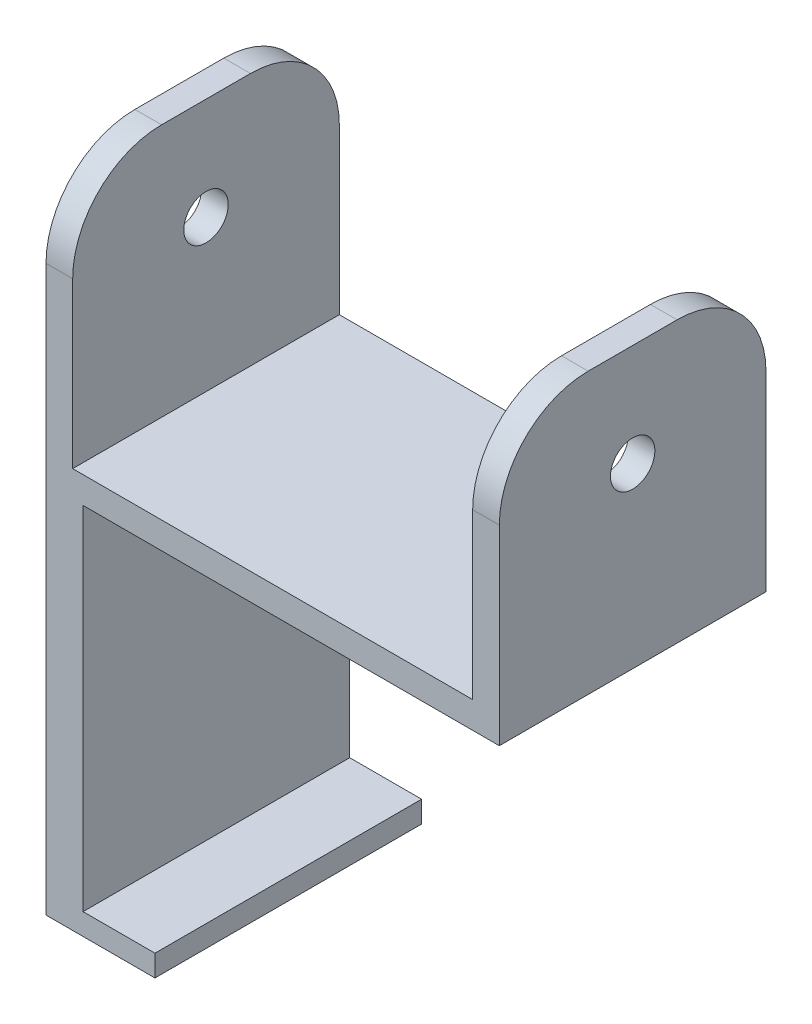
ISO-10303-21;
HEADER;
FILE_DESCRIPTION(('STEP AP214'),'2;1');
FILE_NAME('part.step','',(''),(''),'','','');
FILE_SCHEMA(('AUTOMOTIVE_DESIGN { 1 0 10303 214 1 1 1 1 }'));
ENDSEC;
DATA;
#1=APPLICATION_CONTEXT('core data for automotive mechanical design processes');
#2=APPLICATION_PROTOCOL_DEFINITION('international standard','automotive_design',2000,#1);
#3=PRODUCT_CONTEXT('',#1,'mechanical');
#4=PRODUCT('Part','Part','',(#3));
#5=PRODUCT_RELATED_PRODUCT_CATEGORY('part','',(#4));
#6=PRODUCT_DEFINITION_FORMATION('','',#4);
#7=PRODUCT_DEFINITION_CONTEXT('part definition',#1,'design');
#8=PRODUCT_DEFINITION('design','',#6,#7);
#9=PRODUCT_DEFINITION_SHAPE('','',#8);
#10=(LENGTH_UNIT() NAMED_UNIT(*) SI_UNIT(.MILLI.,.METRE.));
#11=(NAMED_UNIT(*) PLANE_ANGLE_UNIT() SI_UNIT($,.RADIAN.));
#12=(NAMED_UNIT(*) SI_UNIT($,.STERADIAN.) SOLID_ANGLE_UNIT());
#13=UNCERTAINTY_MEASURE_WITH_UNIT(LENGTH_MEASURE(1.E-05),#10,'distance_accuracy_value','');
#14=(GEOMETRIC_REPRESENTATION_CONTEXT(3) GLOBAL_UNCERTAINTY_ASSIGNED_CONTEXT((#13)) GLOBAL_UNIT_ASSIGNED_CONTEXT((#10,
#11,#12)) REPRESENTATION_CONTEXT('',''));
#15=CARTESIAN_POINT('',(0.,0.,0.));
#16=DIRECTION('',(0.,0.,1.));
#17=DIRECTION('',(1.,0.,0.));
#18=AXIS2_PLACEMENT_3D('',#15,#16,#17);
#19=CARTESIAN_POINT('',(27.6785714285714,0.,15.));
#20=DIRECTION('',(-1.,0.,0.));
#21=DIRECTION('',(0.,0.,1.));
#22=AXIS2_PLACEMENT_3D('',#19,#20,#21);
#23=PLANE('',#22);
#24=CARTESIAN_POINT('',(27.6785714285714,18.5,0.));
#25=DIRECTION('',(1.,0.,0.));
#26=DIRECTION('',(0.,0.,-1.));
#27=AXIS2_PLACEMENT_3D('',#24,#25,#26);
#28=CIRCLE('',#27,2.5);
#29=CARTESIAN_POINT('',(27.6785714285714,18.5,-2.5));
#30=VERTEX_POINT('',#29);
#31=EDGE_CURVE('E249',#30,#30,#28,.T.);
#32=ORIENTED_EDGE('',*,*,#31,.F.);
#33=EDGE_LOOP('',(#32));
#34=FACE_BOUND('',#33,.T.);
#35=DIRECTION('',(0.,0.,-1.));
#36=VECTOR('',#35,1.);
#37=CARTESIAN_POINT('',(27.6785714285714,30.,15.));
#38=LINE('',#37,#36);
#39=CARTESIAN_POINT('',(27.6785714285714,30.,5.));
#40=VERTEX_POINT('',#39);
#41=CARTESIAN_POINT('',(27.6785714285714,30.,-5.));
#42=VERTEX_POINT('',#41);
#43=EDGE_CURVE('E212',#40,#42,#38,.T.);
#44=ORIENTED_EDGE('',*,*,#43,.F.);
#45=CARTESIAN_POINT('',(27.6785714285714,20.,5.));
#46=DIRECTION('',(-1.,0.,0.));
#47=DIRECTION('',(0.,0.,1.));
#48=AXIS2_PLACEMENT_3D('',#45,#46,#47);
#49=CIRCLE('',#48,10.);
#50=CARTESIAN_POINT('',(27.6785714285714,20.,15.));
#51=VERTEX_POINT('',#50);
#52=EDGE_CURVE('E222',#40,#51,#49,.F.);
#53=ORIENTED_EDGE('',*,*,#52,.T.);
#54=DIRECTION('',(0.,1.,0.));
#55=VECTOR('',#54,1.);
#56=CARTESIAN_POINT('',(27.6785714285714,0.,15.));
#57=LINE('',#56,#55);
#58=CARTESIAN_POINT('',(27.6785714285714,-1.5,15.));
#59=VERTEX_POINT('',#58);
#60=EDGE_CURVE('E268',#59,#51,#57,.T.);
#61=ORIENTED_EDGE('',*,*,#60,.F.);
#62=DIRECTION('',(0.,0.,-1.));
#63=VECTOR('',#62,1.);
#64=CARTESIAN_POINT('',(27.6785714285714,-1.5,15.));
#65=LINE('',#64,#63);
#66=CARTESIAN_POINT('',(27.6785714285714,-1.5,-15.));
#67=VERTEX_POINT('',#66);
#68=EDGE_CURVE('E168',#59,#67,#65,.T.);
#69=ORIENTED_EDGE('',*,*,#68,.T.);
#70=DIRECTION('',(0.,1.,0.));
#71=VECTOR('',#70,1.);
#72=CARTESIAN_POINT('',(27.6785714285714,0.,-15.));
#73=LINE('',#72,#71);
#74=CARTESIAN_POINT('',(27.6785714285714,20.,-15.));
#75=VERTEX_POINT('',#74);
#76=EDGE_CURVE('E186',#67,#75,#73,.T.);
#77=ORIENTED_EDGE('',*,*,#76,.T.);
#78=CARTESIAN_POINT('',(27.6785714285714,20.,-5.));
#79=DIRECTION('',(-1.,0.,0.));
#80=DIRECTION('',(0.,0.,1.));
#81=AXIS2_PLACEMENT_3D('',#78,#79,#80);
#82=CIRCLE('',#81,10.);
#83=EDGE_CURVE('E220',#75,#42,#82,.F.);
#84=ORIENTED_EDGE('',*,*,#83,.T.);
#85=EDGE_LOOP('',(#44,#53,#61,#69,#77,#84));
#86=FACE_BOUND('',#85,.T.);
#87=ADVANCED_FACE('F32',(#34,#86),#23,.F.);
#88=CARTESIAN_POINT('',(24.6785714285714,30.,15.));
#89=DIRECTION('',(0.,1.,0.));
#90=DIRECTION('',(0.,0.,1.));
#91=AXIS2_PLACEMENT_3D('',#88,#89,#90);
#92=PLANE('',#91);
#93=DIRECTION('',(0.,0.,-1.));
#94=VECTOR('',#93,1.);
#95=CARTESIAN_POINT('',(24.6785714285714,30.,15.));
#96=LINE('',#95,#94);
#97=CARTESIAN_POINT('',(24.6785714285714,30.,5.));
#98=VERTEX_POINT('',#97);
#99=CARTESIAN_POINT('',(24.6785714285714,30.,-5.));
#100=VERTEX_POINT('',#99);
#101=EDGE_CURVE('E209',#98,#100,#96,.T.);
#102=ORIENTED_EDGE('',*,*,#101,.F.);
#103=DIRECTION('',(1.,0.,0.));
#104=VECTOR('',#103,1.);
#105=CARTESIAN_POINT('',(27.6785714285714,30.,5.));
#106=LINE('',#105,#104);
#107=EDGE_CURVE('E217',#98,#40,#106,.T.);
#108=ORIENTED_EDGE('',*,*,#107,.T.);
#109=ORIENTED_EDGE('',*,*,#43,.T.);
#110=DIRECTION('',(1.,0.,0.));
#111=VECTOR('',#110,1.);
#112=CARTESIAN_POINT('',(24.6785714285714,30.,-5.));
#113=LINE('',#112,#111);
#114=EDGE_CURVE('E215',#42,#100,#113,.F.);
#115=ORIENTED_EDGE('',*,*,#114,.T.);
#116=EDGE_LOOP('',(#102,#108,#109,#115));
#117=FACE_BOUND('',#116,.T.);
#118=ADVANCED_FACE('F298',(#117),#92,.T.);
#119=CARTESIAN_POINT('',(24.6785714285714,0.,15.));
#120=DIRECTION('',(-1.,0.,0.));
#121=DIRECTION('',(0.,0.,1.));
#122=AXIS2_PLACEMENT_3D('',#119,#120,#121);
#123=PLANE('',#122);
#124=CARTESIAN_POINT('',(24.6785714285714,18.5,0.));
#125=DIRECTION('',(-1.,0.,0.));
#126=DIRECTION('',(0.,0.,1.));
#127=AXIS2_PLACEMENT_3D('',#124,#125,#126);
#128=CIRCLE('',#127,2.5);
#129=CARTESIAN_POINT('',(24.6785714285714,18.5,2.5));
#130=VERTEX_POINT('',#129);
#131=EDGE_CURVE('E190',#130,#130,#128,.T.);
#132=ORIENTED_EDGE('',*,*,#131,.F.);
#133=EDGE_LOOP('',(#132));
#134=FACE_BOUND('',#133,.T.);
#135=DIRECTION('',(0.,1.,0.));
#136=VECTOR('',#135,1.);
#137=CARTESIAN_POINT('',(24.6785714285714,0.,15.));
#138=LINE('',#137,#136);
#139=CARTESIAN_POINT('',(24.6785714285714,1.5,15.));
#140=VERTEX_POINT('',#139);
#141=CARTESIAN_POINT('',(24.6785714285714,20.,15.));
#142=VERTEX_POINT('',#141);
#143=EDGE_CURVE('E270',#140,#142,#138,.T.);
#144=ORIENTED_EDGE('',*,*,#143,.T.);
#145=CARTESIAN_POINT('',(24.6785714285714,20.,5.));
#146=DIRECTION('',(-1.,0.,0.));
#147=DIRECTION('',(0.,0.,1.));
#148=AXIS2_PLACEMENT_3D('',#145,#146,#147);
#149=CIRCLE('',#148,10.);
#150=EDGE_CURVE('E230',#142,#98,#149,.T.);
#151=ORIENTED_EDGE('',*,*,#150,.T.);
#152=ORIENTED_EDGE('',*,*,#101,.T.);
#153=CARTESIAN_POINT('',(24.6785714285714,20.,-5.));
#154=DIRECTION('',(-1.,0.,0.));
#155=DIRECTION('',(0.,0.,1.));
#156=AXIS2_PLACEMENT_3D('',#153,#154,#155);
#157=CIRCLE('',#156,10.);
#158=CARTESIAN_POINT('',(24.6785714285714,20.,-15.));
#159=VERTEX_POINT('',#158);
#160=EDGE_CURVE('E228',#100,#159,#157,.T.);
#161=ORIENTED_EDGE('',*,*,#160,.T.);
#162=DIRECTION('',(0.,1.,0.));
#163=VECTOR('',#162,1.);
#164=CARTESIAN_POINT('',(24.6785714285714,0.,-15.));
#165=LINE('',#164,#163);
#166=CARTESIAN_POINT('',(24.6785714285714,1.5,-15.));
#167=VERTEX_POINT('',#166);
#168=EDGE_CURVE('E189',#167,#159,#165,.T.);
#169=ORIENTED_EDGE('',*,*,#168,.F.);
#170=DIRECTION('',(0.,0.,-1.));
#171=VECTOR('',#170,1.);
#172=CARTESIAN_POINT('',(24.6785714285714,1.5,15.));
#173=LINE('',#172,#171);
#174=EDGE_CURVE('E207',#140,#167,#173,.T.);
#175=ORIENTED_EDGE('',*,*,#174,.F.);
#176=EDGE_LOOP('',(#144,#151,#152,#161,#169,#175));
#177=FACE_BOUND('',#176,.T.);
#178=ADVANCED_FACE('F290',(#134,#177),#123,.T.);
#179=CARTESIAN_POINT('',(-21.8214285714286,1.5,15.));
#180=DIRECTION('',(0.,1.,0.));
#181=DIRECTION('',(0.,0.,1.));
#182=AXIS2_PLACEMENT_3D('',#179,#180,#181);
#183=PLANE('',#182);
#184=DIRECTION('',(1.,0.,0.));
#185=VECTOR('',#184,1.);
#186=CARTESIAN_POINT('',(-21.8214285714286,1.5,-15.));
#187=LINE('',#186,#185);
#188=CARTESIAN_POINT('',(-20.3214285714286,1.5,-15.));
#189=VERTEX_POINT('',#188);
#190=EDGE_CURVE('E193',#189,#167,#187,.T.);
#191=ORIENTED_EDGE('',*,*,#190,.F.);
#192=DIRECTION('',(0.,0.,-1.));
#193=VECTOR('',#192,1.);
#194=CARTESIAN_POINT('',(-20.3214285714286,1.5,15.));
#195=LINE('',#194,#193);
#196=CARTESIAN_POINT('',(-20.3214285714286,1.5,15.));
#197=VERTEX_POINT('',#196);
#198=EDGE_CURVE('E204',#197,#189,#195,.T.);
#199=ORIENTED_EDGE('',*,*,#198,.F.);
#200=DIRECTION('',(1.,0.,0.));
#201=VECTOR('',#200,1.);
#202=CARTESIAN_POINT('',(-21.8214285714286,1.5,15.));
#203=LINE('',#202,#201);
#204=EDGE_CURVE('E273',#197,#140,#203,.T.);
#205=ORIENTED_EDGE('',*,*,#204,.T.);
#206=ORIENTED_EDGE('',*,*,#174,.T.);
#207=EDGE_LOOP('',(#191,#199,#205,#206));
#208=FACE_BOUND('',#207,.T.);
#209=ADVANCED_FACE('F285',(#208),#183,.T.);
#210=CARTESIAN_POINT('',(-20.3214285714286,30.,15.));
#211=DIRECTION('',(1.,0.,0.));
#212=DIRECTION('',(0.,0.,-1.));
#213=AXIS2_PLACEMENT_3D('',#210,#211,#212);
#214=PLANE('',#213);
#215=CARTESIAN_POINT('',(-20.3214285714286,18.5,0.));
#216=DIRECTION('',(1.,0.,0.));
#217=DIRECTION('',(0.,0.,-1.));
#218=AXIS2_PLACEMENT_3D('',#215,#216,#217);
#219=CIRCLE('',#218,2.5);
#220=CARTESIAN_POINT('',(-20.3214285714286,18.5,-2.5));
#221=VERTEX_POINT('',#220);
#222=EDGE_CURVE('E248',#221,#221,#219,.T.);
#223=ORIENTED_EDGE('',*,*,#222,.F.);
#224=EDGE_LOOP('',(#223));
#225=FACE_BOUND('',#224,.T.);
#226=DIRECTION('',(0.,1.,0.));
#227=VECTOR('',#226,1.);
#228=CARTESIAN_POINT('',(-20.3214285714286,30.,-15.));
#229=LINE('',#228,#227);
#230=CARTESIAN_POINT('',(-20.3214285714286,20.,-15.));
#231=VERTEX_POINT('',#230);
#232=EDGE_CURVE('E196',#231,#189,#229,.F.);
#233=ORIENTED_EDGE('',*,*,#232,.F.);
#234=CARTESIAN_POINT('',(-20.3214285714286,20.,-5.));
#235=DIRECTION('',(1.,0.,0.));
#236=DIRECTION('',(0.,0.,-1.));
#237=AXIS2_PLACEMENT_3D('',#234,#235,#236);
#238=CIRCLE('',#237,10.);
#239=CARTESIAN_POINT('',(-20.3214285714286,30.,-5.));
#240=VERTEX_POINT('',#239);
#241=EDGE_CURVE('E240',#231,#240,#238,.T.);
#242=ORIENTED_EDGE('',*,*,#241,.T.);
#243=DIRECTION('',(0.,0.,-1.));
#244=VECTOR('',#243,1.);
#245=CARTESIAN_POINT('',(-20.3214285714286,30.,15.));
#246=LINE('',#245,#244);
#247=CARTESIAN_POINT('',(-20.3214285714286,30.,5.));
#248=VERTEX_POINT('',#247);
#249=EDGE_CURVE('E202',#248,#240,#246,.T.);
#250=ORIENTED_EDGE('',*,*,#249,.F.);
#251=CARTESIAN_POINT('',(-20.3214285714286,20.,5.));
#252=DIRECTION('',(1.,0.,0.));
#253=DIRECTION('',(0.,0.,-1.));
#254=AXIS2_PLACEMENT_3D('',#251,#252,#253);
#255=CIRCLE('',#254,10.);
#256=CARTESIAN_POINT('',(-20.3214285714286,20.,15.));
#257=VERTEX_POINT('',#256);
#258=EDGE_CURVE('E238',#248,#257,#255,.T.);
#259=ORIENTED_EDGE('',*,*,#258,.T.);
#260=DIRECTION('',(0.,1.,0.));
#261=VECTOR('',#260,1.);
#262=CARTESIAN_POINT('',(-20.3214285714286,30.,15.));
#263=LINE('',#262,#261);
#264=EDGE_CURVE('E174',#257,#197,#263,.F.);
#265=ORIENTED_EDGE('',*,*,#264,.T.);
#266=ORIENTED_EDGE('',*,*,#198,.T.);
#267=EDGE_LOOP('',(#233,#242,#250,#259,#265,#266));
#268=FACE_BOUND('',#267,.T.);
#269=ADVANCED_FACE('F279',(#225,#268),#214,.T.);
#270=CARTESIAN_POINT('',(-23.3214285714286,30.,15.));
#271=DIRECTION('',(0.,1.,0.));
#272=DIRECTION('',(0.,0.,1.));
#273=AXIS2_PLACEMENT_3D('',#270,#271,#272);
#274=PLANE('',#273);
#275=ORIENTED_EDGE('',*,*,#249,.T.);
#276=DIRECTION('',(1.,0.,0.));
#277=VECTOR('',#276,1.);
#278=CARTESIAN_POINT('',(-23.3214285714286,30.,-5.));
#279=LINE('',#278,#277);
#280=CARTESIAN_POINT('',(-23.3214285714286,30.,-5.));
#281=VERTEX_POINT('',#280);
#282=EDGE_CURVE('E57',#240,#281,#279,.F.);
#283=ORIENTED_EDGE('',*,*,#282,.T.);
#284=DIRECTION('',(0.,0.,-1.));
#285=VECTOR('',#284,1.);
#286=CARTESIAN_POINT('',(-23.3214285714286,30.,15.));
#287=LINE('',#286,#285);
#288=CARTESIAN_POINT('',(-23.3214285714286,30.,5.));
#289=VERTEX_POINT('',#288);
#290=EDGE_CURVE('E172',#289,#281,#287,.T.);
#291=ORIENTED_EDGE('',*,*,#290,.F.);
#292=DIRECTION('',(1.,0.,0.));
#293=VECTOR('',#292,1.);
#294=CARTESIAN_POINT('',(-20.3214285714286,30.,5.));
#295=LINE('',#294,#293);
#296=EDGE_CURVE('E242',#289,#248,#295,.T.);
#297=ORIENTED_EDGE('',*,*,#296,.T.);
#298=EDGE_LOOP('',(#275,#283,#291,#297));
#299=FACE_BOUND('',#298,.T.);
#300=ADVANCED_FACE('F311',(#299),#274,.T.);
#301=CARTESIAN_POINT('',(-23.3214285714286,30.,15.));
#302=DIRECTION('',(1.,0.,0.));
#303=DIRECTION('',(0.,0.,-1.));
#304=AXIS2_PLACEMENT_3D('',#301,#302,#303);
#305=PLANE('',#304);
#306=CARTESIAN_POINT('',(-23.3214285714286,18.5,0.));
#307=DIRECTION('',(1.,0.,0.));
#308=DIRECTION('',(0.,0.,-1.));
#309=AXIS2_PLACEMENT_3D('',#306,#307,#308);
#310=CIRCLE('',#309,2.5);
#311=CARTESIAN_POINT('',(-23.3214285714286,18.5,-2.5));
#312=VERTEX_POINT('',#311);
#313=EDGE_CURVE('E246',#312,#312,#310,.T.);
#314=ORIENTED_EDGE('',*,*,#313,.T.);
#315=EDGE_LOOP('',(#314));
#316=FACE_BOUND('',#315,.T.);
#317=ORIENTED_EDGE('',*,*,#290,.T.);
#318=CARTESIAN_POINT('',(-23.3214285714286,20.,-5.));
#319=DIRECTION('',(1.,0.,0.));
#320=DIRECTION('',(0.,0.,-1.));
#321=AXIS2_PLACEMENT_3D('',#318,#319,#320);
#322=CIRCLE('',#321,10.);
#323=CARTESIAN_POINT('',(-23.3214285714286,20.,-15.));
#324=VERTEX_POINT('',#323);
#325=EDGE_CURVE('E11',#281,#324,#322,.F.);
#326=ORIENTED_EDGE('',*,*,#325,.T.);
#327=DIRECTION('',(0.,1.,0.));
#328=VECTOR('',#327,1.);
#329=CARTESIAN_POINT('',(-23.3214285714286,30.,-15.));
#330=LINE('',#329,#328);
#331=CARTESIAN_POINT('',(-23.3214285714286,-43.5,-15.));
#332=VERTEX_POINT('',#331);
#333=EDGE_CURVE('E198',#324,#332,#330,.F.);
#334=ORIENTED_EDGE('',*,*,#333,.T.);
#335=DIRECTION('',(0.,0.,-1.));
#336=VECTOR('',#335,1.);
#337=CARTESIAN_POINT('',(-23.3214285714286,-43.5,15.));
#338=LINE('',#337,#336);
#339=CARTESIAN_POINT('',(-23.3214285714286,-43.5,15.));
#340=VERTEX_POINT('',#339);
#341=EDGE_CURVE('E255',#340,#332,#338,.T.);
#342=ORIENTED_EDGE('',*,*,#341,.F.);
#343=DIRECTION('',(0.,1.,0.));
#344=VECTOR('',#343,1.);
#345=CARTESIAN_POINT('',(-23.3214285714286,30.,15.));
#346=LINE('',#345,#344);
#347=CARTESIAN_POINT('',(-23.3214285714286,20.,15.));
#348=VERTEX_POINT('',#347);
#349=EDGE_CURVE('E170',#348,#340,#346,.F.);
#350=ORIENTED_EDGE('',*,*,#349,.F.);
#351=CARTESIAN_POINT('',(-23.3214285714286,20.,5.));
#352=DIRECTION('',(1.,0.,0.));
#353=DIRECTION('',(0.,0.,-1.));
#354=AXIS2_PLACEMENT_3D('',#351,#352,#353);
#355=CIRCLE('',#354,10.);
#356=EDGE_CURVE('E41',#348,#289,#355,.F.);
#357=ORIENTED_EDGE('',*,*,#356,.T.);
#358=EDGE_LOOP('',(#317,#326,#334,#342,#350,#357));
#359=FACE_BOUND('',#358,.T.);
#360=ADVANCED_FACE('F316',(#316,#359),#305,.F.);
#361=CARTESIAN_POINT('',(-21.8214285714286,-1.5,15.));
#362=DIRECTION('',(0.,1.,0.));
#363=DIRECTION('',(0.,0.,1.));
#364=AXIS2_PLACEMENT_3D('',#361,#362,#363);
#365=PLANE('',#364);
#366=DIRECTION('',(1.,0.,0.));
#367=VECTOR('',#366,1.);
#368=CARTESIAN_POINT('',(-21.8214285714286,-1.5,15.));
#369=LINE('',#368,#367);
#370=CARTESIAN_POINT('',(-19.1532200865723,-1.5,15.));
#371=VERTEX_POINT('',#370);
#372=EDGE_CURVE('E160',#371,#59,#369,.T.);
#373=ORIENTED_EDGE('',*,*,#372,.F.);
#374=DIRECTION('',(0.,0.,-1.));
#375=VECTOR('',#374,1.);
#376=CARTESIAN_POINT('',(-19.1532200865723,-1.5,15.));
#377=LINE('',#376,#375);
#378=CARTESIAN_POINT('',(-19.1532200865723,-1.5,-15.));
#379=VERTEX_POINT('',#378);
#380=EDGE_CURVE('E146',#371,#379,#377,.T.);
#381=ORIENTED_EDGE('',*,*,#380,.T.);
#382=DIRECTION('',(1.,0.,0.));
#383=VECTOR('',#382,1.);
#384=CARTESIAN_POINT('',(-21.8214285714286,-1.5,-15.));
#385=LINE('',#384,#383);
#386=EDGE_CURVE('E179',#379,#67,#385,.T.);
#387=ORIENTED_EDGE('',*,*,#386,.T.);
#388=ORIENTED_EDGE('',*,*,#68,.F.);
#389=EDGE_LOOP('',(#373,#381,#387,#388));
#390=FACE_BOUND('',#389,.T.);
#391=ADVANCED_FACE('F166',(#390),#365,.F.);
#392=CARTESIAN_POINT('',(0.,0.,15.));
#393=DIRECTION('',(0.,0.,-1.));
#394=DIRECTION('',(-1.,0.,0.));
#395=AXIS2_PLACEMENT_3D('',#392,#393,#394);
#396=PLANE('',#395);
#397=ORIENTED_EDGE('',*,*,#60,.T.);
#398=DIRECTION('',(1.,0.,0.));
#399=VECTOR('',#398,1.);
#400=CARTESIAN_POINT('',(24.6785714285714,20.,15.));
#401=LINE('',#400,#399);
#402=EDGE_CURVE('E226',#51,#142,#401,.F.);
#403=ORIENTED_EDGE('',*,*,#402,.T.);
#404=ORIENTED_EDGE('',*,*,#143,.F.);
#405=ORIENTED_EDGE('',*,*,#204,.F.);
#406=ORIENTED_EDGE('',*,*,#264,.F.);
#407=DIRECTION('',(1.,0.,0.));
#408=VECTOR('',#407,1.);
#409=CARTESIAN_POINT('',(-23.3214285714286,20.,15.));
#410=LINE('',#409,#408);
#411=EDGE_CURVE('E224',#257,#348,#410,.F.);
#412=ORIENTED_EDGE('',*,*,#411,.T.);
#413=ORIENTED_EDGE('',*,*,#349,.T.);
#414=DIRECTION('',(-1.,0.,0.));
#415=VECTOR('',#414,1.);
#416=CARTESIAN_POINT('',(-23.3214285714286,-43.5,15.));
#417=LINE('',#416,#415);
#418=CARTESIAN_POINT('',(-11.0651303855747,-43.5,15.));
#419=VERTEX_POINT('',#418);
#420=EDGE_CURVE('E154',#419,#340,#417,.T.);
#421=ORIENTED_EDGE('',*,*,#420,.F.);
#422=DIRECTION('',(0.,-1.,0.));
#423=VECTOR('',#422,1.);
#424=CARTESIAN_POINT('',(-11.0651303855747,-43.5,15.));
#425=LINE('',#424,#423);
#426=CARTESIAN_POINT('',(-11.0651303855747,-41.0796311838181,15.));
#427=VERTEX_POINT('',#426);
#428=EDGE_CURVE('E338',#427,#419,#425,.T.);
#429=ORIENTED_EDGE('',*,*,#428,.F.);
#430=DIRECTION('',(1.,0.,0.));
#431=VECTOR('',#430,1.);
#432=CARTESIAN_POINT('',(-11.0651303855747,-41.0796311838181,15.));
#433=LINE('',#432,#431);
#434=CARTESIAN_POINT('',(-19.1532200865723,-41.0796311838181,15.));
#435=VERTEX_POINT('',#434);
#436=EDGE_CURVE('E164',#435,#427,#433,.T.);
#437=ORIENTED_EDGE('',*,*,#436,.F.);
#438=DIRECTION('',(0.,-1.,0.));
#439=VECTOR('',#438,1.);
#440=CARTESIAN_POINT('',(-19.1532200865723,-41.0796311838181,15.));
#441=LINE('',#440,#439);
#442=EDGE_CURVE('E149',#371,#435,#441,.T.);
#443=ORIENTED_EDGE('',*,*,#442,.F.);
#444=ORIENTED_EDGE('',*,*,#372,.T.);
#445=EDGE_LOOP('',(#397,#403,#404,#405,#406,#412,#413,#421,#429,#437,#443,#444));
#446=FACE_BOUND('',#445,.T.);
#447=ADVANCED_FACE('F159',(#446),#396,.F.);
#448=CARTESIAN_POINT('',(0.,0.,-15.));
#449=DIRECTION('',(0.,0.,-1.));
#450=DIRECTION('',(-1.,0.,0.));
#451=AXIS2_PLACEMENT_3D('',#448,#449,#450);
#452=PLANE('',#451);
#453=ORIENTED_EDGE('',*,*,#168,.T.);
#454=DIRECTION('',(1.,0.,0.));
#455=VECTOR('',#454,1.);
#456=CARTESIAN_POINT('',(0.,20.,-15.));
#457=LINE('',#456,#455);
#458=EDGE_CURVE('E235',#159,#75,#457,.T.);
#459=ORIENTED_EDGE('',*,*,#458,.T.);
#460=ORIENTED_EDGE('',*,*,#76,.F.);
#461=ORIENTED_EDGE('',*,*,#386,.F.);
#462=DIRECTION('',(0.,-1.,0.));
#463=VECTOR('',#462,1.);
#464=CARTESIAN_POINT('',(-19.1532200865723,-41.0796311838181,-15.));
#465=LINE('',#464,#463);
#466=CARTESIAN_POINT('',(-19.1532200865723,-41.0796311838181,-15.));
#467=VERTEX_POINT('',#466);
#468=EDGE_CURVE('E49',#379,#467,#465,.T.);
#469=ORIENTED_EDGE('',*,*,#468,.T.);
#470=DIRECTION('',(1.,0.,0.));
#471=VECTOR('',#470,1.);
#472=CARTESIAN_POINT('',(-11.0651303855747,-41.0796311838181,-15.));
#473=LINE('',#472,#471);
#474=CARTESIAN_POINT('',(-11.0651303855747,-41.0796311838181,-15.));
#475=VERTEX_POINT('',#474);
#476=EDGE_CURVE('E326',#467,#475,#473,.T.);
#477=ORIENTED_EDGE('',*,*,#476,.T.);
#478=DIRECTION('',(0.,-1.,0.));
#479=VECTOR('',#478,1.);
#480=CARTESIAN_POINT('',(-11.0651303855747,-43.5,-15.));
#481=LINE('',#480,#479);
#482=CARTESIAN_POINT('',(-11.0651303855747,-43.5,-15.));
#483=VERTEX_POINT('',#482);
#484=EDGE_CURVE('E323',#475,#483,#481,.T.);
#485=ORIENTED_EDGE('',*,*,#484,.T.);
#486=DIRECTION('',(-1.,0.,0.));
#487=VECTOR('',#486,1.);
#488=CARTESIAN_POINT('',(-23.3214285714286,-43.5,-15.));
#489=LINE('',#488,#487);
#490=EDGE_CURVE('E165',#483,#332,#489,.T.);
#491=ORIENTED_EDGE('',*,*,#490,.T.);
#492=ORIENTED_EDGE('',*,*,#333,.F.);
#493=DIRECTION('',(1.,0.,0.));
#494=VECTOR('',#493,1.);
#495=CARTESIAN_POINT('',(0.,20.,-15.));
#496=LINE('',#495,#494);
#497=EDGE_CURVE('E232',#324,#231,#496,.T.);
#498=ORIENTED_EDGE('',*,*,#497,.T.);
#499=ORIENTED_EDGE('',*,*,#232,.T.);
#500=ORIENTED_EDGE('',*,*,#190,.T.);
#501=EDGE_LOOP('',(#453,#459,#460,#461,#469,#477,#485,#491,#492,#498,#499,#500));
#502=FACE_BOUND('',#501,.T.);
#503=ADVANCED_FACE('F307',(#502),#452,.T.);
#504=CARTESIAN_POINT('',(24.6785714285714,20.,5.));
#505=DIRECTION('',(-1.,0.,0.));
#506=DIRECTION('',(0.,0.,1.));
#507=AXIS2_PLACEMENT_3D('',#504,#505,#506);
#508=CYLINDRICAL_SURFACE('',#507,10.);
#509=ORIENTED_EDGE('',*,*,#150,.F.);
#510=ORIENTED_EDGE('',*,*,#402,.F.);
#511=ORIENTED_EDGE('',*,*,#52,.F.);
#512=ORIENTED_EDGE('',*,*,#107,.F.);
#513=EDGE_LOOP('',(#509,#510,#511,#512));
#514=FACE_BOUND('',#513,.T.);
#515=ADVANCED_FACE('F295',(#514),#508,.T.);
#516=CARTESIAN_POINT('',(0.,20.,-5.));
#517=DIRECTION('',(1.,0.,0.));
#518=DIRECTION('',(0.,0.,-1.));
#519=AXIS2_PLACEMENT_3D('',#516,#517,#518);
#520=CYLINDRICAL_SURFACE('',#519,10.);
#521=ORIENTED_EDGE('',*,*,#160,.F.);
#522=ORIENTED_EDGE('',*,*,#114,.F.);
#523=ORIENTED_EDGE('',*,*,#83,.F.);
#524=ORIENTED_EDGE('',*,*,#458,.F.);
#525=EDGE_LOOP('',(#521,#522,#523,#524));
#526=FACE_BOUND('',#525,.T.);
#527=ADVANCED_FACE('F305',(#526),#520,.T.);
#528=CARTESIAN_POINT('',(0.,20.,-5.));
#529=DIRECTION('',(1.,0.,0.));
#530=DIRECTION('',(0.,0.,-1.));
#531=AXIS2_PLACEMENT_3D('',#528,#529,#530);
#532=CYLINDRICAL_SURFACE('',#531,10.);
#533=ORIENTED_EDGE('',*,*,#325,.F.);
#534=ORIENTED_EDGE('',*,*,#282,.F.);
#535=ORIENTED_EDGE('',*,*,#241,.F.);
#536=ORIENTED_EDGE('',*,*,#497,.F.);
#537=EDGE_LOOP('',(#533,#534,#535,#536));
#538=FACE_BOUND('',#537,.T.);
#539=ADVANCED_FACE('F314',(#538),#532,.T.);
#540=CARTESIAN_POINT('',(-23.3214285714286,20.,5.));
#541=DIRECTION('',(-1.,0.,0.));
#542=DIRECTION('',(0.,0.,1.));
#543=AXIS2_PLACEMENT_3D('',#540,#541,#542);
#544=CYLINDRICAL_SURFACE('',#543,10.);
#545=ORIENTED_EDGE('',*,*,#356,.F.);
#546=ORIENTED_EDGE('',*,*,#411,.F.);
#547=ORIENTED_EDGE('',*,*,#258,.F.);
#548=ORIENTED_EDGE('',*,*,#296,.F.);
#549=EDGE_LOOP('',(#545,#546,#547,#548));
#550=FACE_BOUND('',#549,.T.);
#551=ADVANCED_FACE('F34',(#550),#544,.T.);
#552=CARTESIAN_POINT('',(-27.3214285714286,18.5,0.));
#553=DIRECTION('',(1.,0.,0.));
#554=DIRECTION('',(0.,0.,-1.));
#555=AXIS2_PLACEMENT_3D('',#552,#553,#554);
#556=CYLINDRICAL_SURFACE('',#555,2.5);
#557=ORIENTED_EDGE('',*,*,#222,.T.);
#558=EDGE_LOOP('',(#557));
#559=FACE_BOUND('',#558,.T.);
#560=ORIENTED_EDGE('',*,*,#313,.F.);
#561=EDGE_LOOP('',(#560));
#562=FACE_BOUND('',#561,.T.);
#563=ADVANCED_FACE('F349',(#559,#562),#556,.F.);
#564=ORIENTED_EDGE('',*,*,#131,.T.);
#565=EDGE_LOOP('',(#564));
#566=FACE_BOUND('',#565,.T.);
#567=ORIENTED_EDGE('',*,*,#31,.T.);
#568=EDGE_LOOP('',(#567));
#569=FACE_BOUND('',#568,.T.);
#570=ADVANCED_FACE('F354',(#566,#569),#556,.F.);
#571=CARTESIAN_POINT('',(-23.3214285714286,-43.5,15.));
#572=DIRECTION('',(0.,-1.,0.));
#573=DIRECTION('',(1.,0.,0.));
#574=AXIS2_PLACEMENT_3D('',#571,#572,#573);
#575=PLANE('',#574);
#576=ORIENTED_EDGE('',*,*,#490,.F.);
#577=DIRECTION('',(0.,0.,-1.));
#578=VECTOR('',#577,1.);
#579=CARTESIAN_POINT('',(-11.0651303855747,-43.5,15.));
#580=LINE('',#579,#578);
#581=EDGE_CURVE('E260',#419,#483,#580,.T.);
#582=ORIENTED_EDGE('',*,*,#581,.F.);
#583=ORIENTED_EDGE('',*,*,#420,.T.);
#584=ORIENTED_EDGE('',*,*,#341,.T.);
#585=EDGE_LOOP('',(#576,#582,#583,#584));
#586=FACE_BOUND('',#585,.T.);
#587=ADVANCED_FACE('F345',(#586),#575,.T.);
#588=CARTESIAN_POINT('',(-11.0651303855747,-43.5,15.));
#589=DIRECTION('',(1.,0.,0.));
#590=DIRECTION('',(0.,0.,-1.));
#591=AXIS2_PLACEMENT_3D('',#588,#589,#590);
#592=PLANE('',#591);
#593=ORIENTED_EDGE('',*,*,#484,.F.);
#594=DIRECTION('',(0.,0.,-1.));
#595=VECTOR('',#594,1.);
#596=CARTESIAN_POINT('',(-11.0651303855747,-41.0796311838181,15.));
#597=LINE('',#596,#595);
#598=EDGE_CURVE('E331',#427,#475,#597,.T.);
#599=ORIENTED_EDGE('',*,*,#598,.F.);
#600=ORIENTED_EDGE('',*,*,#428,.T.);
#601=ORIENTED_EDGE('',*,*,#581,.T.);
#602=EDGE_LOOP('',(#593,#599,#600,#601));
#603=FACE_BOUND('',#602,.T.);
#604=ADVANCED_FACE('F342',(#603),#592,.T.);
#605=CARTESIAN_POINT('',(-11.0651303855747,-41.0796311838181,15.));
#606=DIRECTION('',(0.,1.,0.));
#607=DIRECTION('',(0.,0.,1.));
#608=AXIS2_PLACEMENT_3D('',#605,#606,#607);
#609=PLANE('',#608);
#610=ORIENTED_EDGE('',*,*,#476,.F.);
#611=DIRECTION('',(0.,0.,-1.));
#612=VECTOR('',#611,1.);
#613=CARTESIAN_POINT('',(-19.1532200865723,-41.0796311838181,15.));
#614=LINE('',#613,#612);
#615=EDGE_CURVE('E153',#435,#467,#614,.T.);
#616=ORIENTED_EDGE('',*,*,#615,.F.);
#617=ORIENTED_EDGE('',*,*,#436,.T.);
#618=ORIENTED_EDGE('',*,*,#598,.T.);
#619=EDGE_LOOP('',(#610,#616,#617,#618));
#620=FACE_BOUND('',#619,.T.);
#621=ADVANCED_FACE('F334',(#620),#609,.T.);
#622=CARTESIAN_POINT('',(-19.1532200865723,-41.0796311838181,15.));
#623=DIRECTION('',(1.,0.,0.));
#624=DIRECTION('',(0.,1.,0.));
#625=AXIS2_PLACEMENT_3D('',#622,#623,#624);
#626=PLANE('',#625);
#627=ORIENTED_EDGE('',*,*,#468,.F.);
#628=ORIENTED_EDGE('',*,*,#380,.F.);
#629=ORIENTED_EDGE('',*,*,#442,.T.);
#630=ORIENTED_EDGE('',*,*,#615,.T.);
#631=EDGE_LOOP('',(#627,#628,#629,#630));
#632=FACE_BOUND('',#631,.T.);
#633=ADVANCED_FACE('F148',(#632),#626,.T.);
#634=CLOSED_SHELL('',(#87,#118,#178,#209,#269,#300,#360,#391,#447,#503,#515,#527,#539,#551,#563,
#570,#587,#604,#621,#633));
#635=MANIFOLD_SOLID_BREP('B2',#634);
#636=ADVANCED_BREP_SHAPE_REPRESENTATION('',(#18,#635),#14);
#637=SHAPE_DEFINITION_REPRESENTATION(#9,#636);
ENDSEC;
END-ISO-10303-21;
